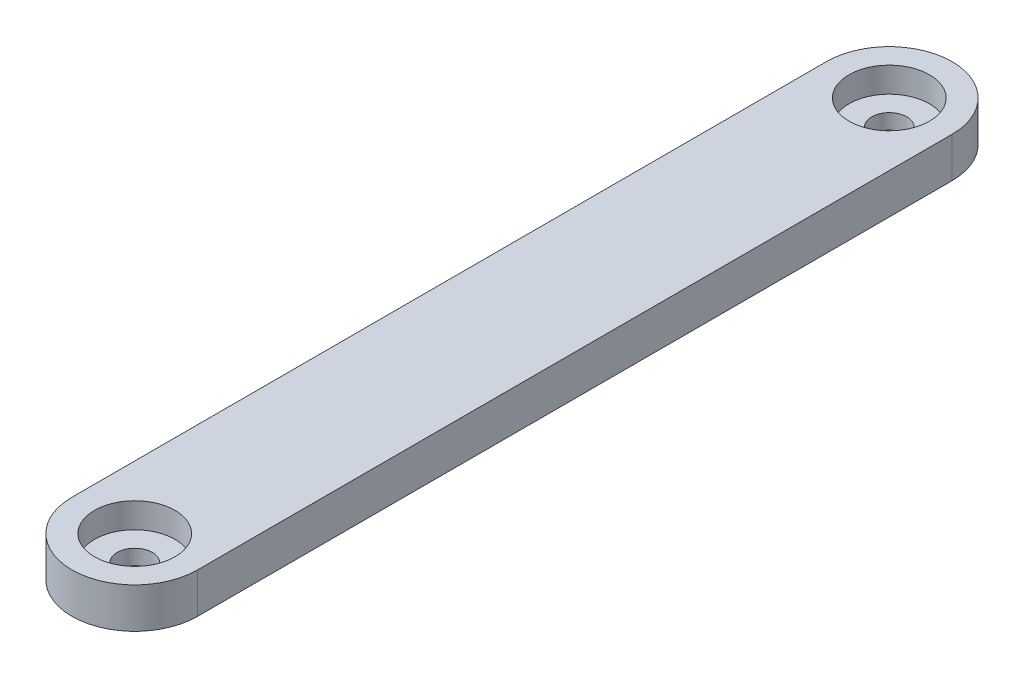
ISO-10303-21;
HEADER;
FILE_DESCRIPTION(('STEP AP214'),'2;1');
FILE_NAME('part.step','',(''),(''),'','','');
FILE_SCHEMA(('AUTOMOTIVE_DESIGN { 1 0 10303 214 1 1 1 1 }'));
ENDSEC;
DATA;
#1=APPLICATION_CONTEXT('core data for automotive mechanical design processes');
#2=APPLICATION_PROTOCOL_DEFINITION('international standard','automotive_design',2000,#1);
#3=PRODUCT_CONTEXT('',#1,'mechanical');
#4=PRODUCT('Part','Part','',(#3));
#5=PRODUCT_RELATED_PRODUCT_CATEGORY('part','',(#4));
#6=PRODUCT_DEFINITION_FORMATION('','',#4);
#7=PRODUCT_DEFINITION_CONTEXT('part definition',#1,'design');
#8=PRODUCT_DEFINITION('design','',#6,#7);
#9=PRODUCT_DEFINITION_SHAPE('','',#8);
#10=(LENGTH_UNIT() NAMED_UNIT(*) SI_UNIT(.MILLI.,.METRE.));
#11=(NAMED_UNIT(*) PLANE_ANGLE_UNIT() SI_UNIT($,.RADIAN.));
#12=(NAMED_UNIT(*) SI_UNIT($,.STERADIAN.) SOLID_ANGLE_UNIT());
#13=UNCERTAINTY_MEASURE_WITH_UNIT(LENGTH_MEASURE(1.E-05),#10,'distance_accuracy_value','');
#14=(GEOMETRIC_REPRESENTATION_CONTEXT(3) GLOBAL_UNCERTAINTY_ASSIGNED_CONTEXT((#13)) GLOBAL_UNIT_ASSIGNED_CONTEXT((#10,
#11,#12)) REPRESENTATION_CONTEXT('',''));
#15=CARTESIAN_POINT('',(0.,0.,0.));
#16=DIRECTION('',(0.,0.,1.));
#17=DIRECTION('',(1.,0.,0.));
#18=AXIS2_PLACEMENT_3D('',#15,#16,#17);
#19=CARTESIAN_POINT('',(0.,8.,0.));
#20=DIRECTION('',(0.,-1.,0.));
#21=DIRECTION('',(0.,0.,-1.));
#22=AXIS2_PLACEMENT_3D('',#19,#20,#21);
#23=CYLINDRICAL_SURFACE('',#22,12.5);
#24=CARTESIAN_POINT('',(0.,0.,0.));
#25=DIRECTION('',(0.,1.,0.));
#26=DIRECTION('',(0.,0.,1.));
#27=AXIS2_PLACEMENT_3D('',#24,#25,#26);
#28=CIRCLE('',#27,12.5);
#29=CARTESIAN_POINT('',(12.5,0.,0.));
#30=VERTEX_POINT('',#29);
#31=CARTESIAN_POINT('',(-12.5,0.,0.));
#32=VERTEX_POINT('',#31);
#33=EDGE_CURVE('E102',#30,#32,#28,.T.);
#34=ORIENTED_EDGE('',*,*,#33,.T.);
#35=DIRECTION('',(0.,-1.,0.));
#36=VECTOR('',#35,1.);
#37=CARTESIAN_POINT('',(-12.5,8.,0.));
#38=LINE('',#37,#36);
#39=CARTESIAN_POINT('',(-12.5,8.,0.));
#40=VERTEX_POINT('',#39);
#41=EDGE_CURVE('E11',#40,#32,#38,.T.);
#42=ORIENTED_EDGE('',*,*,#41,.F.);
#43=CARTESIAN_POINT('',(0.,8.,0.));
#44=DIRECTION('',(0.,1.,0.));
#45=DIRECTION('',(0.,0.,1.));
#46=AXIS2_PLACEMENT_3D('',#43,#44,#45);
#47=CIRCLE('',#46,12.5);
#48=CARTESIAN_POINT('',(12.5,8.,0.));
#49=VERTEX_POINT('',#48);
#50=EDGE_CURVE('E89',#49,#40,#47,.T.);
#51=ORIENTED_EDGE('',*,*,#50,.F.);
#52=DIRECTION('',(0.,-1.,0.));
#53=VECTOR('',#52,1.);
#54=CARTESIAN_POINT('',(12.5,8.,0.));
#55=LINE('',#54,#53);
#56=EDGE_CURVE('E98',#49,#30,#55,.T.);
#57=ORIENTED_EDGE('',*,*,#56,.T.);
#58=EDGE_LOOP('',(#34,#42,#51,#57));
#59=FACE_BOUND('',#58,.T.);
#60=ADVANCED_FACE('F36',(#59),#23,.T.);
#61=CARTESIAN_POINT('',(-12.5,8.,0.));
#62=DIRECTION('',(1.,0.,0.));
#63=DIRECTION('',(0.,0.,-1.));
#64=AXIS2_PLACEMENT_3D('',#61,#62,#63);
#65=PLANE('',#64);
#66=DIRECTION('',(0.,0.,1.));
#67=VECTOR('',#66,1.);
#68=CARTESIAN_POINT('',(-12.5,0.,0.));
#69=LINE('',#68,#67);
#70=CARTESIAN_POINT('',(-12.5,0.,150.));
#71=VERTEX_POINT('',#70);
#72=EDGE_CURVE('E93',#32,#71,#69,.T.);
#73=ORIENTED_EDGE('',*,*,#72,.T.);
#74=DIRECTION('',(0.,-1.,0.));
#75=VECTOR('',#74,1.);
#76=CARTESIAN_POINT('',(-12.5,8.,150.));
#77=LINE('',#76,#75);
#78=CARTESIAN_POINT('',(-12.5,8.,150.));
#79=VERTEX_POINT('',#78);
#80=EDGE_CURVE('E45',#79,#71,#77,.T.);
#81=ORIENTED_EDGE('',*,*,#80,.F.);
#82=DIRECTION('',(0.,0.,1.));
#83=VECTOR('',#82,1.);
#84=CARTESIAN_POINT('',(-12.5,8.,0.));
#85=LINE('',#84,#83);
#86=EDGE_CURVE('E84',#40,#79,#85,.T.);
#87=ORIENTED_EDGE('',*,*,#86,.F.);
#88=ORIENTED_EDGE('',*,*,#41,.T.);
#89=EDGE_LOOP('',(#73,#81,#87,#88));
#90=FACE_BOUND('',#89,.T.);
#91=ADVANCED_FACE('F92',(#90),#65,.F.);
#92=CARTESIAN_POINT('',(0.,8.,150.));
#93=DIRECTION('',(0.,-1.,0.));
#94=DIRECTION('',(0.,0.,-1.));
#95=AXIS2_PLACEMENT_3D('',#92,#93,#94);
#96=CYLINDRICAL_SURFACE('',#95,12.5);
#97=CARTESIAN_POINT('',(0.,0.,150.));
#98=DIRECTION('',(0.,1.,0.));
#99=DIRECTION('',(0.,0.,1.));
#100=AXIS2_PLACEMENT_3D('',#97,#98,#99);
#101=CIRCLE('',#100,12.5);
#102=CARTESIAN_POINT('',(12.5,0.,150.));
#103=VERTEX_POINT('',#102);
#104=EDGE_CURVE('E71',#71,#103,#101,.T.);
#105=ORIENTED_EDGE('',*,*,#104,.T.);
#106=DIRECTION('',(0.,-1.,0.));
#107=VECTOR('',#106,1.);
#108=CARTESIAN_POINT('',(12.5,8.,150.));
#109=LINE('',#108,#107);
#110=CARTESIAN_POINT('',(12.5,8.,150.));
#111=VERTEX_POINT('',#110);
#112=EDGE_CURVE('E94',#111,#103,#109,.T.);
#113=ORIENTED_EDGE('',*,*,#112,.F.);
#114=CARTESIAN_POINT('',(0.,8.,150.));
#115=DIRECTION('',(0.,1.,0.));
#116=DIRECTION('',(0.,0.,1.));
#117=AXIS2_PLACEMENT_3D('',#114,#115,#116);
#118=CIRCLE('',#117,12.5);
#119=EDGE_CURVE('E87',#79,#111,#118,.T.);
#120=ORIENTED_EDGE('',*,*,#119,.F.);
#121=ORIENTED_EDGE('',*,*,#80,.T.);
#122=EDGE_LOOP('',(#105,#113,#120,#121));
#123=FACE_BOUND('',#122,.T.);
#124=ADVANCED_FACE('F96',(#123),#96,.T.);
#125=CARTESIAN_POINT('',(12.5,8.,0.));
#126=DIRECTION('',(-1.,0.,0.));
#127=DIRECTION('',(0.,0.,1.));
#128=AXIS2_PLACEMENT_3D('',#125,#126,#127);
#129=PLANE('',#128);
#130=DIRECTION('',(0.,0.,-1.));
#131=VECTOR('',#130,1.);
#132=CARTESIAN_POINT('',(12.5,0.,0.));
#133=LINE('',#132,#131);
#134=EDGE_CURVE('E77',#103,#30,#133,.T.);
#135=ORIENTED_EDGE('',*,*,#134,.T.);
#136=ORIENTED_EDGE('',*,*,#56,.F.);
#137=DIRECTION('',(0.,0.,-1.));
#138=VECTOR('',#137,1.);
#139=CARTESIAN_POINT('',(12.5,8.,0.));
#140=LINE('',#139,#138);
#141=EDGE_CURVE('E54',#111,#49,#140,.T.);
#142=ORIENTED_EDGE('',*,*,#141,.F.);
#143=ORIENTED_EDGE('',*,*,#112,.T.);
#144=EDGE_LOOP('',(#135,#136,#142,#143));
#145=FACE_BOUND('',#144,.T.);
#146=ADVANCED_FACE('F141',(#145),#129,.F.);
#147=CARTESIAN_POINT('',(0.,8.,0.));
#148=DIRECTION('',(0.,1.,0.));
#149=DIRECTION('',(0.,0.,1.));
#150=AXIS2_PLACEMENT_3D('',#147,#148,#149);
#151=PLANE('',#150);
#152=CARTESIAN_POINT('',(0.,8.,150.));
#153=DIRECTION('',(0.,1.,0.));
#154=DIRECTION('',(0.,0.,1.));
#155=AXIS2_PLACEMENT_3D('',#152,#153,#154);
#156=CIRCLE('',#155,8.);
#157=CARTESIAN_POINT('',(0.,8.,158.));
#158=VERTEX_POINT('',#157);
#159=EDGE_CURVE('E124',#158,#158,#156,.T.);
#160=ORIENTED_EDGE('',*,*,#159,.F.);
#161=EDGE_LOOP('',(#160));
#162=FACE_BOUND('',#161,.T.);
#163=CARTESIAN_POINT('',(0.,8.,0.));
#164=DIRECTION('',(0.,1.,0.));
#165=DIRECTION('',(0.,0.,1.));
#166=AXIS2_PLACEMENT_3D('',#163,#164,#165);
#167=CIRCLE('',#166,8.);
#168=CARTESIAN_POINT('',(0.,8.,8.));
#169=VERTEX_POINT('',#168);
#170=EDGE_CURVE('E112',#169,#169,#167,.T.);
#171=ORIENTED_EDGE('',*,*,#170,.F.);
#172=EDGE_LOOP('',(#171));
#173=FACE_BOUND('',#172,.T.);
#174=ORIENTED_EDGE('',*,*,#50,.T.);
#175=ORIENTED_EDGE('',*,*,#86,.T.);
#176=ORIENTED_EDGE('',*,*,#119,.T.);
#177=ORIENTED_EDGE('',*,*,#141,.T.);
#178=EDGE_LOOP('',(#174,#175,#176,#177));
#179=FACE_BOUND('',#178,.T.);
#180=ADVANCED_FACE('F85',(#162,#173,#179),#151,.T.);
#181=CARTESIAN_POINT('',(0.,0.,0.));
#182=DIRECTION('',(0.,1.,0.));
#183=DIRECTION('',(0.,0.,1.));
#184=AXIS2_PLACEMENT_3D('',#181,#182,#183);
#185=PLANE('',#184);
#186=CARTESIAN_POINT('',(0.,0.,150.));
#187=DIRECTION('',(0.,1.,0.));
#188=DIRECTION('',(0.,0.,1.));
#189=AXIS2_PLACEMENT_3D('',#186,#187,#188);
#190=CIRCLE('',#189,3.5);
#191=CARTESIAN_POINT('',(0.,0.,153.5));
#192=VERTEX_POINT('',#191);
#193=EDGE_CURVE('E242',#192,#192,#190,.T.);
#194=ORIENTED_EDGE('',*,*,#193,.T.);
#195=EDGE_LOOP('',(#194));
#196=FACE_BOUND('',#195,.T.);
#197=CARTESIAN_POINT('',(0.,0.,0.));
#198=DIRECTION('',(0.,1.,0.));
#199=DIRECTION('',(0.,0.,1.));
#200=AXIS2_PLACEMENT_3D('',#197,#198,#199);
#201=CIRCLE('',#200,3.5);
#202=CARTESIAN_POINT('',(0.,0.,3.5));
#203=VERTEX_POINT('',#202);
#204=EDGE_CURVE('E113',#203,#203,#201,.T.);
#205=ORIENTED_EDGE('',*,*,#204,.T.);
#206=EDGE_LOOP('',(#205));
#207=FACE_BOUND('',#206,.T.);
#208=ORIENTED_EDGE('',*,*,#33,.F.);
#209=ORIENTED_EDGE('',*,*,#134,.F.);
#210=ORIENTED_EDGE('',*,*,#104,.F.);
#211=ORIENTED_EDGE('',*,*,#72,.F.);
#212=EDGE_LOOP('',(#208,#209,#210,#211));
#213=FACE_BOUND('',#212,.T.);
#214=ADVANCED_FACE('F136',(#196,#207,#213),#185,.F.);
#215=CARTESIAN_POINT('',(0.,3.,0.));
#216=DIRECTION('',(0.,1.,0.));
#217=DIRECTION('',(0.,0.,1.));
#218=AXIS2_PLACEMENT_3D('',#215,#216,#217);
#219=CYLINDRICAL_SURFACE('',#218,8.);
#220=CARTESIAN_POINT('',(0.,3.,0.));
#221=DIRECTION('',(0.,1.,0.));
#222=DIRECTION('',(0.,0.,1.));
#223=AXIS2_PLACEMENT_3D('',#220,#221,#222);
#224=CIRCLE('',#223,8.);
#225=CARTESIAN_POINT('',(0.,3.,8.));
#226=VERTEX_POINT('',#225);
#227=EDGE_CURVE('E105',#226,#226,#224,.T.);
#228=ORIENTED_EDGE('',*,*,#227,.F.);
#229=EDGE_LOOP('',(#228));
#230=FACE_BOUND('',#229,.T.);
#231=ORIENTED_EDGE('',*,*,#170,.T.);
#232=EDGE_LOOP('',(#231));
#233=FACE_BOUND('',#232,.T.);
#234=ADVANCED_FACE('F133',(#230,#233),#219,.F.);
#235=CARTESIAN_POINT('',(0.,3.,0.));
#236=DIRECTION('',(0.,1.,0.));
#237=DIRECTION('',(0.,0.,1.));
#238=AXIS2_PLACEMENT_3D('',#235,#236,#237);
#239=PLANE('',#238);
#240=CARTESIAN_POINT('',(0.,3.,0.));
#241=DIRECTION('',(0.,1.,0.));
#242=DIRECTION('',(0.,0.,1.));
#243=AXIS2_PLACEMENT_3D('',#240,#241,#242);
#244=CIRCLE('',#243,3.5);
#245=CARTESIAN_POINT('',(0.,3.,3.5));
#246=VERTEX_POINT('',#245);
#247=EDGE_CURVE('E110',#246,#246,#244,.T.);
#248=ORIENTED_EDGE('',*,*,#247,.F.);
#249=EDGE_LOOP('',(#248));
#250=FACE_BOUND('',#249,.T.);
#251=ORIENTED_EDGE('',*,*,#227,.T.);
#252=EDGE_LOOP('',(#251));
#253=FACE_BOUND('',#252,.T.);
#254=ADVANCED_FACE('F131',(#250,#253),#239,.T.);
#255=CARTESIAN_POINT('',(0.,0.,0.));
#256=DIRECTION('',(0.,1.,0.));
#257=DIRECTION('',(0.,0.,1.));
#258=AXIS2_PLACEMENT_3D('',#255,#256,#257);
#259=CYLINDRICAL_SURFACE('',#258,3.5);
#260=ORIENTED_EDGE('',*,*,#247,.T.);
#261=EDGE_LOOP('',(#260));
#262=FACE_BOUND('',#261,.T.);
#263=ORIENTED_EDGE('',*,*,#204,.F.);
#264=EDGE_LOOP('',(#263));
#265=FACE_BOUND('',#264,.T.);
#266=ADVANCED_FACE('F186',(#262,#265),#259,.F.);
#267=CARTESIAN_POINT('',(0.,3.,150.));
#268=DIRECTION('',(0.,1.,0.));
#269=DIRECTION('',(0.,0.,1.));
#270=AXIS2_PLACEMENT_3D('',#267,#268,#269);
#271=CYLINDRICAL_SURFACE('',#270,8.);
#272=CARTESIAN_POINT('',(0.,3.,150.));
#273=DIRECTION('',(0.,1.,0.));
#274=DIRECTION('',(0.,0.,1.));
#275=AXIS2_PLACEMENT_3D('',#272,#273,#274);
#276=CIRCLE('',#275,8.);
#277=CARTESIAN_POINT('',(0.,3.,158.));
#278=VERTEX_POINT('',#277);
#279=EDGE_CURVE('E119',#278,#278,#276,.T.);
#280=ORIENTED_EDGE('',*,*,#279,.F.);
#281=EDGE_LOOP('',(#280));
#282=FACE_BOUND('',#281,.T.);
#283=ORIENTED_EDGE('',*,*,#159,.T.);
#284=EDGE_LOOP('',(#283));
#285=FACE_BOUND('',#284,.T.);
#286=ADVANCED_FACE('F195',(#282,#285),#271,.F.);
#287=CARTESIAN_POINT('',(0.,3.,150.));
#288=DIRECTION('',(0.,1.,0.));
#289=DIRECTION('',(0.,0.,1.));
#290=AXIS2_PLACEMENT_3D('',#287,#288,#289);
#291=PLANE('',#290);
#292=CARTESIAN_POINT('',(0.,3.,150.));
#293=DIRECTION('',(0.,1.,0.));
#294=DIRECTION('',(0.,0.,1.));
#295=AXIS2_PLACEMENT_3D('',#292,#293,#294);
#296=CIRCLE('',#295,3.5);
#297=CARTESIAN_POINT('',(0.,3.,153.5));
#298=VERTEX_POINT('',#297);
#299=EDGE_CURVE('E39',#298,#298,#296,.T.);
#300=ORIENTED_EDGE('',*,*,#299,.F.);
#301=EDGE_LOOP('',(#300));
#302=FACE_BOUND('',#301,.T.);
#303=ORIENTED_EDGE('',*,*,#279,.T.);
#304=EDGE_LOOP('',(#303));
#305=FACE_BOUND('',#304,.T.);
#306=ADVANCED_FACE('F208',(#302,#305),#291,.T.);
#307=CARTESIAN_POINT('',(0.,0.,150.));
#308=DIRECTION('',(0.,1.,0.));
#309=DIRECTION('',(0.,0.,1.));
#310=AXIS2_PLACEMENT_3D('',#307,#308,#309);
#311=CYLINDRICAL_SURFACE('',#310,3.5);
#312=ORIENTED_EDGE('',*,*,#299,.T.);
#313=EDGE_LOOP('',(#312));
#314=FACE_BOUND('',#313,.T.);
#315=ORIENTED_EDGE('',*,*,#193,.F.);
#316=EDGE_LOOP('',(#315));
#317=FACE_BOUND('',#316,.T.);
#318=ADVANCED_FACE('F223',(#314,#317),#311,.F.);
#319=CLOSED_SHELL('',(#60,#91,#124,#146,#180,#214,#234,#254,#266,#286,#306,#318));
#320=MANIFOLD_SOLID_BREP('B2',#319);
#321=ADVANCED_BREP_SHAPE_REPRESENTATION('',(#18,#320),#14);
#322=SHAPE_DEFINITION_REPRESENTATION(#9,#321);
ENDSEC;
END-ISO-10303-21;
